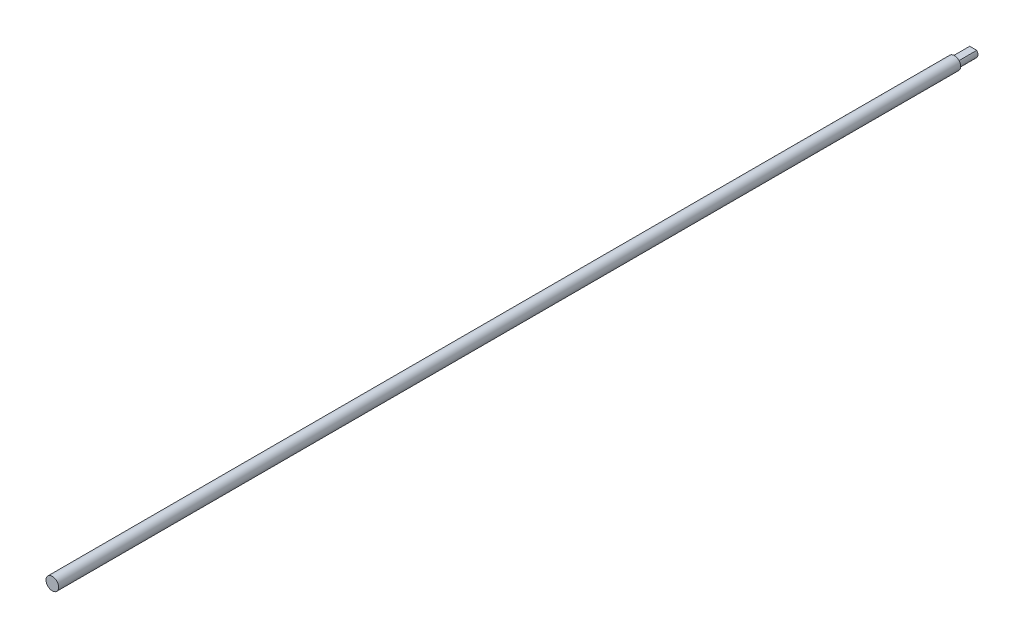
ISO-10303-21;
HEADER;
FILE_DESCRIPTION(('STEP AP214'),'2;1');
FILE_NAME('part.step','',(''),(''),'','','');
FILE_SCHEMA(('AUTOMOTIVE_DESIGN { 1 0 10303 214 1 1 1 1 }'));
ENDSEC;
DATA;
#1=APPLICATION_CONTEXT('core data for automotive mechanical design processes');
#2=APPLICATION_PROTOCOL_DEFINITION('international standard','automotive_design',2000,#1);
#3=PRODUCT_CONTEXT('',#1,'mechanical');
#4=PRODUCT('Part','Part','',(#3));
#5=PRODUCT_RELATED_PRODUCT_CATEGORY('part','',(#4));
#6=PRODUCT_DEFINITION_FORMATION('','',#4);
#7=PRODUCT_DEFINITION_CONTEXT('part definition',#1,'design');
#8=PRODUCT_DEFINITION('design','',#6,#7);
#9=PRODUCT_DEFINITION_SHAPE('','',#8);
#10=(LENGTH_UNIT() NAMED_UNIT(*) SI_UNIT(.MILLI.,.METRE.));
#11=(NAMED_UNIT(*) PLANE_ANGLE_UNIT() SI_UNIT($,.RADIAN.));
#12=(NAMED_UNIT(*) SI_UNIT($,.STERADIAN.) SOLID_ANGLE_UNIT());
#13=UNCERTAINTY_MEASURE_WITH_UNIT(LENGTH_MEASURE(1.E-05),#10,'distance_accuracy_value','');
#14=(GEOMETRIC_REPRESENTATION_CONTEXT(3) GLOBAL_UNCERTAINTY_ASSIGNED_CONTEXT((#13)) GLOBAL_UNIT_ASSIGNED_CONTEXT((#10,
#11,#12)) REPRESENTATION_CONTEXT('',''));
#15=CARTESIAN_POINT('',(0.,0.,0.));
#16=DIRECTION('',(0.,0.,1.));
#17=DIRECTION('',(1.,0.,0.));
#18=AXIS2_PLACEMENT_3D('',#15,#16,#17);
#19=CARTESIAN_POINT('',(0.,0.,0.));
#20=DIRECTION('',(0.,0.,1.));
#21=DIRECTION('',(1.,0.,0.));
#22=AXIS2_PLACEMENT_3D('',#19,#20,#21);
#23=PLANE('',#22);
#24=DIRECTION('',(-1.,0.,0.));
#25=VECTOR('',#24,1.);
#26=CARTESIAN_POINT('',(10.,2.,0.));
#27=LINE('',#26,#25);
#28=CARTESIAN_POINT('',(2.23606797749979,2.,0.));
#29=VERTEX_POINT('',#28);
#30=CARTESIAN_POINT('',(-2.23606797749979,2.,0.));
#31=VERTEX_POINT('',#30);
#32=EDGE_CURVE('E67',#29,#31,#27,.T.);
#33=ORIENTED_EDGE('',*,*,#32,.F.);
#34=CARTESIAN_POINT('',(0.,0.,0.));
#35=DIRECTION('',(0.,0.,-1.));
#36=DIRECTION('',(-1.,0.,0.));
#37=AXIS2_PLACEMENT_3D('',#34,#35,#36);
#38=CIRCLE('',#37,3.);
#39=EDGE_CURVE('E59',#29,#31,#38,.T.);
#40=ORIENTED_EDGE('',*,*,#39,.T.);
#41=EDGE_LOOP('',(#33,#40));
#42=FACE_BOUND('',#41,.T.);
#43=ADVANCED_FACE('F35',(#42),#23,.F.);
#44=CARTESIAN_POINT('',(0.,0.,0.));
#45=DIRECTION('',(0.,0.,1.));
#46=DIRECTION('',(1.,0.,0.));
#47=AXIS2_PLACEMENT_3D('',#44,#45,#46);
#48=CYLINDRICAL_SURFACE('',#47,4.);
#49=CARTESIAN_POINT('',(0.,0.,12.));
#50=DIRECTION('',(0.,0.,-1.));
#51=DIRECTION('',(-1.,0.,0.));
#52=AXIS2_PLACEMENT_3D('',#49,#50,#51);
#53=CIRCLE('',#52,4.);
#54=CARTESIAN_POINT('',(-4.,0.,12.));
#55=VERTEX_POINT('',#54);
#56=EDGE_CURVE('E64',#55,#55,#53,.F.);
#57=ORIENTED_EDGE('',*,*,#56,.T.);
#58=EDGE_LOOP('',(#57));
#59=FACE_BOUND('',#58,.T.);
#60=CARTESIAN_POINT('',(0.,0.,584.));
#61=DIRECTION('',(0.,0.,1.));
#62=DIRECTION('',(1.,0.,0.));
#63=AXIS2_PLACEMENT_3D('',#60,#61,#62);
#64=CIRCLE('',#63,4.);
#65=CARTESIAN_POINT('',(4.,0.,584.));
#66=VERTEX_POINT('',#65);
#67=EDGE_CURVE('E72',#66,#66,#64,.T.);
#68=ORIENTED_EDGE('',*,*,#67,.F.);
#69=EDGE_LOOP('',(#68));
#70=FACE_BOUND('',#69,.T.);
#71=ADVANCED_FACE('F81',(#59,#70),#48,.T.);
#72=CARTESIAN_POINT('',(0.,0.,584.));
#73=DIRECTION('',(0.,0.,1.));
#74=DIRECTION('',(1.,0.,0.));
#75=AXIS2_PLACEMENT_3D('',#72,#73,#74);
#76=PLANE('',#75);
#77=ORIENTED_EDGE('',*,*,#67,.T.);
#78=EDGE_LOOP('',(#77));
#79=FACE_BOUND('',#78,.T.);
#80=ADVANCED_FACE('F86',(#79),#76,.T.);
#81=CARTESIAN_POINT('',(10.,2.,12.));
#82=DIRECTION('',(0.,0.,-1.));
#83=DIRECTION('',(-1.,0.,0.));
#84=AXIS2_PLACEMENT_3D('',#81,#82,#83);
#85=PLANE('',#84);
#86=DIRECTION('',(-1.,0.,0.));
#87=VECTOR('',#86,1.);
#88=CARTESIAN_POINT('',(10.,2.,12.));
#89=LINE('',#88,#87);
#90=CARTESIAN_POINT('',(2.23606797749979,2.,12.));
#91=VERTEX_POINT('',#90);
#92=CARTESIAN_POINT('',(-2.23606797749979,2.,12.));
#93=VERTEX_POINT('',#92);
#94=EDGE_CURVE('E70',#91,#93,#89,.T.);
#95=ORIENTED_EDGE('',*,*,#94,.T.);
#96=CARTESIAN_POINT('',(0.,0.,12.));
#97=DIRECTION('',(0.,0.,-1.));
#98=DIRECTION('',(-1.,0.,0.));
#99=AXIS2_PLACEMENT_3D('',#96,#97,#98);
#100=CIRCLE('',#99,3.);
#101=EDGE_CURVE('E48',#91,#93,#100,.T.);
#102=ORIENTED_EDGE('',*,*,#101,.F.);
#103=EDGE_LOOP('',(#95,#102));
#104=FACE_BOUND('',#103,.T.);
#105=ORIENTED_EDGE('',*,*,#56,.F.);
#106=EDGE_LOOP('',(#105));
#107=FACE_BOUND('',#106,.T.);
#108=ADVANCED_FACE('F84',(#104,#107),#85,.T.);
#109=CARTESIAN_POINT('',(10.,2.,0.));
#110=DIRECTION('',(0.,1.,0.));
#111=DIRECTION('',(0.,0.,1.));
#112=AXIS2_PLACEMENT_3D('',#109,#110,#111);
#113=PLANE('',#112);
#114=DIRECTION('',(0.,0.,-1.));
#115=VECTOR('',#114,1.);
#116=CARTESIAN_POINT('',(2.23606797749979,2.,0.));
#117=LINE('',#116,#115);
#118=EDGE_CURVE('E11',#29,#91,#117,.F.);
#119=ORIENTED_EDGE('',*,*,#118,.F.);
#120=ORIENTED_EDGE('',*,*,#32,.T.);
#121=DIRECTION('',(0.,0.,-1.));
#122=VECTOR('',#121,1.);
#123=CARTESIAN_POINT('',(-2.23606797749979,2.,0.));
#124=LINE('',#123,#122);
#125=EDGE_CURVE('E42',#93,#31,#124,.T.);
#126=ORIENTED_EDGE('',*,*,#125,.F.);
#127=ORIENTED_EDGE('',*,*,#94,.F.);
#128=EDGE_LOOP('',(#119,#120,#126,#127));
#129=FACE_BOUND('',#128,.T.);
#130=ADVANCED_FACE('F69',(#129),#113,.T.);
#131=CARTESIAN_POINT('',(0.,0.,0.));
#132=DIRECTION('',(0.,0.,-1.));
#133=DIRECTION('',(-1.,0.,0.));
#134=AXIS2_PLACEMENT_3D('',#131,#132,#133);
#135=CYLINDRICAL_SURFACE('',#134,3.);
#136=ORIENTED_EDGE('',*,*,#118,.T.);
#137=ORIENTED_EDGE('',*,*,#101,.T.);
#138=ORIENTED_EDGE('',*,*,#125,.T.);
#139=ORIENTED_EDGE('',*,*,#39,.F.);
#140=EDGE_LOOP('',(#136,#137,#138,#139));
#141=FACE_BOUND('',#140,.T.);
#142=ADVANCED_FACE('F58',(#141),#135,.T.);
#143=CLOSED_SHELL('',(#43,#71,#80,#108,#130,#142));
#144=MANIFOLD_SOLID_BREP('B2',#143);
#145=ADVANCED_BREP_SHAPE_REPRESENTATION('',(#18,#144),#14);
#146=SHAPE_DEFINITION_REPRESENTATION(#9,#145);
ENDSEC;
END-ISO-10303-21;
